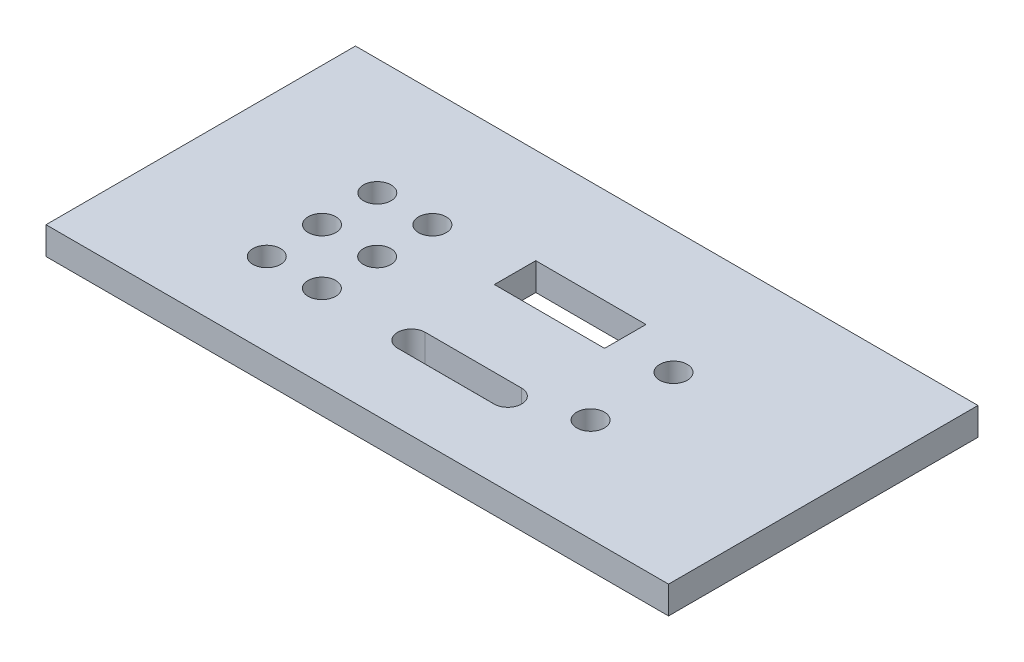
ISO-10303-21;
HEADER;
FILE_DESCRIPTION(('STEP AP214'),'2;1');
FILE_NAME('part.step','',(''),(''),'','','');
FILE_SCHEMA(('AUTOMOTIVE_DESIGN { 1 0 10303 214 1 1 1 1 }'));
ENDSEC;
DATA;
#1=APPLICATION_CONTEXT('core data for automotive mechanical design processes');
#2=APPLICATION_PROTOCOL_DEFINITION('international standard','automotive_design',2000,#1);
#3=PRODUCT_CONTEXT('',#1,'mechanical');
#4=PRODUCT('Part','Part','',(#3));
#5=PRODUCT_RELATED_PRODUCT_CATEGORY('part','',(#4));
#6=PRODUCT_DEFINITION_FORMATION('','',#4);
#7=PRODUCT_DEFINITION_CONTEXT('part definition',#1,'design');
#8=PRODUCT_DEFINITION('design','',#6,#7);
#9=PRODUCT_DEFINITION_SHAPE('','',#8);
#10=(LENGTH_UNIT() NAMED_UNIT(*) SI_UNIT(.MILLI.,.METRE.));
#11=(NAMED_UNIT(*) PLANE_ANGLE_UNIT() SI_UNIT($,.RADIAN.));
#12=(NAMED_UNIT(*) SI_UNIT($,.STERADIAN.) SOLID_ANGLE_UNIT());
#13=UNCERTAINTY_MEASURE_WITH_UNIT(LENGTH_MEASURE(1.E-05),#10,'distance_accuracy_value','');
#14=(GEOMETRIC_REPRESENTATION_CONTEXT(3) GLOBAL_UNCERTAINTY_ASSIGNED_CONTEXT((#13)) GLOBAL_UNIT_ASSIGNED_CONTEXT((#10,
#11,#12)) REPRESENTATION_CONTEXT('',''));
#15=CARTESIAN_POINT('',(0.,0.,0.));
#16=DIRECTION('',(0.,0.,1.));
#17=DIRECTION('',(1.,0.,0.));
#18=AXIS2_PLACEMENT_3D('',#15,#16,#17);
#19=CARTESIAN_POINT('',(-112.800521338315,10.,56.0742476017058));
#20=DIRECTION('',(1.,0.,0.));
#21=DIRECTION('',(0.,0.,-1.));
#22=AXIS2_PLACEMENT_3D('',#19,#20,#21);
#23=PLANE('',#22);
#24=DIRECTION('',(0.,0.,1.));
#25=VECTOR('',#24,1.);
#26=CARTESIAN_POINT('',(-112.800521338315,0.,56.0742476017058));
#27=LINE('',#26,#25);
#28=CARTESIAN_POINT('',(-112.800521338315,0.,-56.0742476017058));
#29=VERTEX_POINT('',#28);
#30=CARTESIAN_POINT('',(-112.800521338315,0.,56.0742476017058));
#31=VERTEX_POINT('',#30);
#32=EDGE_CURVE('E210',#29,#31,#27,.T.);
#33=ORIENTED_EDGE('',*,*,#32,.T.);
#34=DIRECTION('',(0.,-1.,0.));
#35=VECTOR('',#34,1.);
#36=CARTESIAN_POINT('',(-112.800521338315,10.,56.0742476017058));
#37=LINE('',#36,#35);
#38=CARTESIAN_POINT('',(-112.800521338315,10.,56.0742476017058));
#39=VERTEX_POINT('',#38);
#40=EDGE_CURVE('E11',#39,#31,#37,.T.);
#41=ORIENTED_EDGE('',*,*,#40,.F.);
#42=DIRECTION('',(0.,0.,1.));
#43=VECTOR('',#42,1.);
#44=CARTESIAN_POINT('',(-112.800521338315,10.,56.0742476017058));
#45=LINE('',#44,#43);
#46=CARTESIAN_POINT('',(-112.800521338315,10.,-56.0742476017058));
#47=VERTEX_POINT('',#46);
#48=EDGE_CURVE('E213',#47,#39,#45,.T.);
#49=ORIENTED_EDGE('',*,*,#48,.F.);
#50=DIRECTION('',(0.,-1.,0.));
#51=VECTOR('',#50,1.);
#52=CARTESIAN_POINT('',(-112.800521338315,10.,-56.0742476017058));
#53=LINE('',#52,#51);
#54=EDGE_CURVE('E223',#47,#29,#53,.T.);
#55=ORIENTED_EDGE('',*,*,#54,.T.);
#56=EDGE_LOOP('',(#33,#41,#49,#55));
#57=FACE_BOUND('',#56,.T.);
#58=ADVANCED_FACE('F33',(#57),#23,.F.);
#59=CARTESIAN_POINT('',(112.800521338315,10.,56.0742476017058));
#60=DIRECTION('',(0.,0.,-1.));
#61=DIRECTION('',(-1.,0.,0.));
#62=AXIS2_PLACEMENT_3D('',#59,#60,#61);
#63=PLANE('',#62);
#64=DIRECTION('',(1.,0.,0.));
#65=VECTOR('',#64,1.);
#66=CARTESIAN_POINT('',(112.800521338315,0.,56.0742476017058));
#67=LINE('',#66,#65);
#68=CARTESIAN_POINT('',(112.800521338315,0.,56.0742476017058));
#69=VERTEX_POINT('',#68);
#70=EDGE_CURVE('E226',#31,#69,#67,.T.);
#71=ORIENTED_EDGE('',*,*,#70,.T.);
#72=DIRECTION('',(0.,-1.,0.));
#73=VECTOR('',#72,1.);
#74=CARTESIAN_POINT('',(112.800521338315,10.,56.0742476017058));
#75=LINE('',#74,#73);
#76=CARTESIAN_POINT('',(112.800521338315,10.,56.0742476017058));
#77=VERTEX_POINT('',#76);
#78=EDGE_CURVE('E40',#77,#69,#75,.T.);
#79=ORIENTED_EDGE('',*,*,#78,.F.);
#80=DIRECTION('',(1.,0.,0.));
#81=VECTOR('',#80,1.);
#82=CARTESIAN_POINT('',(112.800521338315,10.,56.0742476017058));
#83=LINE('',#82,#81);
#84=EDGE_CURVE('E216',#39,#77,#83,.T.);
#85=ORIENTED_EDGE('',*,*,#84,.F.);
#86=ORIENTED_EDGE('',*,*,#40,.T.);
#87=EDGE_LOOP('',(#71,#79,#85,#86));
#88=FACE_BOUND('',#87,.T.);
#89=ADVANCED_FACE('F255',(#88),#63,.F.);
#90=CARTESIAN_POINT('',(112.800521338315,10.,56.0742476017058));
#91=DIRECTION('',(-1.,0.,0.));
#92=DIRECTION('',(0.,0.,1.));
#93=AXIS2_PLACEMENT_3D('',#90,#91,#92);
#94=PLANE('',#93);
#95=DIRECTION('',(0.,0.,-1.));
#96=VECTOR('',#95,1.);
#97=CARTESIAN_POINT('',(112.800521338315,0.,56.0742476017058));
#98=LINE('',#97,#96);
#99=CARTESIAN_POINT('',(112.800521338315,0.,-56.0742476017058));
#100=VERTEX_POINT('',#99);
#101=EDGE_CURVE('E228',#69,#100,#98,.T.);
#102=ORIENTED_EDGE('',*,*,#101,.T.);
#103=DIRECTION('',(0.,-1.,0.));
#104=VECTOR('',#103,1.);
#105=CARTESIAN_POINT('',(112.800521338315,10.,-56.0742476017058));
#106=LINE('',#105,#104);
#107=CARTESIAN_POINT('',(112.800521338315,10.,-56.0742476017058));
#108=VERTEX_POINT('',#107);
#109=EDGE_CURVE('E233',#108,#100,#106,.T.);
#110=ORIENTED_EDGE('',*,*,#109,.F.);
#111=DIRECTION('',(0.,0.,-1.));
#112=VECTOR('',#111,1.);
#113=CARTESIAN_POINT('',(112.800521338315,10.,56.0742476017058));
#114=LINE('',#113,#112);
#115=EDGE_CURVE('E219',#77,#108,#114,.T.);
#116=ORIENTED_EDGE('',*,*,#115,.F.);
#117=ORIENTED_EDGE('',*,*,#78,.T.);
#118=EDGE_LOOP('',(#102,#110,#116,#117));
#119=FACE_BOUND('',#118,.T.);
#120=ADVANCED_FACE('F240',(#119),#94,.F.);
#121=CARTESIAN_POINT('',(112.800521338315,10.,-56.0742476017058));
#122=DIRECTION('',(0.,0.,1.));
#123=DIRECTION('',(1.,0.,0.));
#124=AXIS2_PLACEMENT_3D('',#121,#122,#123);
#125=PLANE('',#124);
#126=DIRECTION('',(-1.,0.,0.));
#127=VECTOR('',#126,1.);
#128=CARTESIAN_POINT('',(112.800521338315,0.,-56.0742476017058));
#129=LINE('',#128,#127);
#130=EDGE_CURVE('E217',#100,#29,#129,.T.);
#131=ORIENTED_EDGE('',*,*,#130,.T.);
#132=ORIENTED_EDGE('',*,*,#54,.F.);
#133=DIRECTION('',(-1.,0.,0.));
#134=VECTOR('',#133,1.);
#135=CARTESIAN_POINT('',(112.800521338315,10.,-56.0742476017058));
#136=LINE('',#135,#134);
#137=EDGE_CURVE('E221',#108,#47,#136,.T.);
#138=ORIENTED_EDGE('',*,*,#137,.F.);
#139=ORIENTED_EDGE('',*,*,#109,.T.);
#140=EDGE_LOOP('',(#131,#132,#138,#139));
#141=FACE_BOUND('',#140,.T.);
#142=ADVANCED_FACE('F248',(#141),#125,.F.);
#143=CARTESIAN_POINT('',(0.,10.,0.));
#144=DIRECTION('',(0.,1.,0.));
#145=DIRECTION('',(0.,0.,1.));
#146=AXIS2_PLACEMENT_3D('',#143,#144,#145);
#147=PLANE('',#146);
#148=CARTESIAN_POINT('',(-62.7722379764121,10.,-13.9539958192126));
#149=DIRECTION('',(0.,1.,0.));
#150=DIRECTION('',(0.,0.,1.));
#151=AXIS2_PLACEMENT_3D('',#148,#149,#150);
#152=CIRCLE('',#151,5.);
#153=CARTESIAN_POINT('',(-62.7722379764121,10.,-8.95399581921262));
#154=VERTEX_POINT('',#153);
#155=EDGE_CURVE('E356',#154,#154,#152,.T.);
#156=ORIENTED_EDGE('',*,*,#155,.F.);
#157=EDGE_LOOP('',(#156));
#158=FACE_BOUND('',#157,.T.);
#159=CARTESIAN_POINT('',(-62.8005013678229,10.,6.04598421029506));
#160=DIRECTION('',(0.,1.,0.));
#161=DIRECTION('',(0.,0.,1.));
#162=AXIS2_PLACEMENT_3D('',#159,#160,#161);
#163=CIRCLE('',#162,5.);
#164=CARTESIAN_POINT('',(-62.8005013678229,10.,11.0459842102951));
#165=VERTEX_POINT('',#164);
#166=EDGE_CURVE('E148',#165,#165,#163,.T.);
#167=ORIENTED_EDGE('',*,*,#166,.F.);
#168=EDGE_LOOP('',(#167));
#169=FACE_BOUND('',#168,.T.);
#170=CARTESIAN_POINT('',(-62.8287647592336,10.,26.0459642398027));
#171=DIRECTION('',(0.,1.,0.));
#172=DIRECTION('',(0.,0.,1.));
#173=AXIS2_PLACEMENT_3D('',#170,#171,#172);
#174=CIRCLE('',#173,5.00000000000001);
#175=CARTESIAN_POINT('',(-62.8287647592336,10.,31.0459642398027));
#176=VERTEX_POINT('',#175);
#177=EDGE_CURVE('E346',#176,#176,#174,.T.);
#178=ORIENTED_EDGE('',*,*,#177,.F.);
#179=EDGE_LOOP('',(#178));
#180=FACE_BOUND('',#179,.T.);
#181=CARTESIAN_POINT('',(-42.8005213383152,10.,6.0742476017058));
#182=DIRECTION('',(0.,1.,0.));
#183=DIRECTION('',(0.,0.,1.));
#184=AXIS2_PLACEMENT_3D('',#181,#182,#183);
#185=CIRCLE('',#184,5.);
#186=CARTESIAN_POINT('',(-42.8005213383152,10.,11.0742476017058));
#187=VERTEX_POINT('',#186);
#188=EDGE_CURVE('E340',#187,#187,#185,.T.);
#189=ORIENTED_EDGE('',*,*,#188,.F.);
#190=EDGE_LOOP('',(#189));
#191=FACE_BOUND('',#190,.T.);
#192=CARTESIAN_POINT('',(47.2241192619538,10.,-11.2985496627651));
#193=DIRECTION('',(0.,1.,0.));
#194=DIRECTION('',(0.,0.,1.));
#195=AXIS2_PLACEMENT_3D('',#192,#193,#194);
#196=CIRCLE('',#195,5.);
#197=CARTESIAN_POINT('',(47.2241192619538,10.,-6.29854966276509));
#198=VERTEX_POINT('',#197);
#199=EDGE_CURVE('E174',#198,#198,#196,.T.);
#200=ORIENTED_EDGE('',*,*,#199,.F.);
#201=EDGE_LOOP('',(#200));
#202=FACE_BOUND('',#201,.T.);
#203=CARTESIAN_POINT('',(24.6711478698625,10.,26.1696165772247));
#204=DIRECTION('',(0.,1.,0.));
#205=DIRECTION('',(0.,0.,1.));
#206=AXIS2_PLACEMENT_3D('',#203,#204,#205);
#207=CIRCLE('',#206,5.);
#208=CARTESIAN_POINT('',(24.6640820220098,10.,31.1696115846016));
#209=VERTEX_POINT('',#208);
#210=CARTESIAN_POINT('',(24.6782137177152,10.,21.1696215698478));
#211=VERTEX_POINT('',#210);
#212=EDGE_CURVE('E47',#209,#211,#207,.T.);
#213=ORIENTED_EDGE('',*,*,#212,.F.);
#214=DIRECTION('',(0.999999001475384,0.,0.00141316957053689));
#215=VECTOR('',#214,1.);
#216=CARTESIAN_POINT('',(24.6640820220098,10.,31.1696115846016));
#217=LINE('',#216,#215);
#218=CARTESIAN_POINT('',(-10.3358830296286,10.,31.1201506496329));
#219=VERTEX_POINT('',#218);
#220=EDGE_CURVE('E182',#219,#209,#217,.T.);
#221=ORIENTED_EDGE('',*,*,#220,.F.);
#222=CARTESIAN_POINT('',(-10.3288171817759,10.,26.1201556422559));
#223=DIRECTION('',(0.,1.,0.));
#224=DIRECTION('',(0.,0.,1.));
#225=AXIS2_PLACEMENT_3D('',#222,#223,#224);
#226=CIRCLE('',#225,5.);
#227=CARTESIAN_POINT('',(-10.3217513339233,10.,21.120160634879));
#228=VERTEX_POINT('',#227);
#229=EDGE_CURVE('E196',#228,#219,#226,.T.);
#230=ORIENTED_EDGE('',*,*,#229,.F.);
#231=DIRECTION('',(-0.999999001475384,0.,-0.00141316957053689));
#232=VECTOR('',#231,1.);
#233=CARTESIAN_POINT('',(24.6782137177152,10.,21.1696215698478));
#234=LINE('',#233,#232);
#235=EDGE_CURVE('E193',#211,#228,#234,.T.);
#236=ORIENTED_EDGE('',*,*,#235,.F.);
#237=EDGE_LOOP('',(#213,#221,#230,#236));
#238=FACE_BOUND('',#237,.T.);
#239=DIRECTION('',(0.00141316957053689,0.,-0.999999001475384));
#240=VECTOR('',#239,1.);
#241=CARTESIAN_POINT('',(27.2382709281515,10.,-21.3268030689297));
#242=LINE('',#241,#240);
#243=CARTESIAN_POINT('',(27.2170733845934,10.,-6.32681804679891));
#244=VERTEX_POINT('',#243);
#245=CARTESIAN_POINT('',(27.2382709281515,10.,-21.3268030689297));
#246=VERTEX_POINT('',#245);
#247=EDGE_CURVE('E55',#244,#246,#242,.T.);
#248=ORIENTED_EDGE('',*,*,#247,.F.);
#249=DIRECTION('',(0.999999001475384,0.,0.00141316957053678));
#250=VECTOR('',#249,1.);
#251=CARTESIAN_POINT('',(-12.782886674422,10.,-6.38334482962039));
#252=LINE('',#251,#250);
#253=CARTESIAN_POINT('',(-12.782886674422,10.,-6.38334482962039));
#254=VERTEX_POINT('',#253);
#255=EDGE_CURVE('E142',#254,#244,#252,.T.);
#256=ORIENTED_EDGE('',*,*,#255,.F.);
#257=DIRECTION('',(-0.00141316957053689,0.,0.999999001475384));
#258=VECTOR('',#257,1.);
#259=CARTESIAN_POINT('',(-12.7616891308639,10.,-21.3833298517511));
#260=LINE('',#259,#258);
#261=CARTESIAN_POINT('',(-12.7616891308639,10.,-21.3833298517511));
#262=VERTEX_POINT('',#261);
#263=EDGE_CURVE('E145',#262,#254,#260,.T.);
#264=ORIENTED_EDGE('',*,*,#263,.F.);
#265=DIRECTION('',(-0.999999001475384,0.,-0.00141316957053671));
#266=VECTOR('',#265,1.);
#267=CARTESIAN_POINT('',(-12.7616891308639,10.,-21.3833298517511));
#268=LINE('',#267,#266);
#269=EDGE_CURVE('E154',#246,#262,#268,.T.);
#270=ORIENTED_EDGE('',*,*,#269,.F.);
#271=EDGE_LOOP('',(#248,#256,#264,#270));
#272=FACE_BOUND('',#271,.T.);
#273=CARTESIAN_POINT('',(-42.7722579469045,10.,-13.9257324278019));
#274=DIRECTION('',(0.,1.,0.));
#275=DIRECTION('',(0.,0.,1.));
#276=AXIS2_PLACEMENT_3D('',#273,#274,#275);
#277=CIRCLE('',#276,5.);
#278=CARTESIAN_POINT('',(-42.7722579469045,10.,-8.92573242780188));
#279=VERTEX_POINT('',#278);
#280=EDGE_CURVE('E166',#279,#279,#277,.T.);
#281=ORIENTED_EDGE('',*,*,#280,.F.);
#282=EDGE_LOOP('',(#281));
#283=FACE_BOUND('',#282,.T.);
#284=CARTESIAN_POINT('',(-42.8287847297259,10.,26.0742276312135));
#285=DIRECTION('',(0.,1.,0.));
#286=DIRECTION('',(0.,0.,1.));
#287=AXIS2_PLACEMENT_3D('',#284,#285,#286);
#288=CIRCLE('',#287,5.00000000000001);
#289=CARTESIAN_POINT('',(-42.8287847297259,10.,31.0742276312135));
#290=VERTEX_POINT('',#289);
#291=EDGE_CURVE('E337',#290,#290,#288,.T.);
#292=ORIENTED_EDGE('',*,*,#291,.F.);
#293=EDGE_LOOP('',(#292));
#294=FACE_BOUND('',#293,.T.);
#295=CARTESIAN_POINT('',(47.1817241748377,10.,18.7014203814964));
#296=DIRECTION('',(0.,1.,0.));
#297=DIRECTION('',(0.,0.,1.));
#298=AXIS2_PLACEMENT_3D('',#295,#296,#297);
#299=CIRCLE('',#298,5.);
#300=CARTESIAN_POINT('',(47.1817241748377,10.,23.7014203814964));
#301=VERTEX_POINT('',#300);
#302=EDGE_CURVE('E173',#301,#301,#299,.T.);
#303=ORIENTED_EDGE('',*,*,#302,.F.);
#304=EDGE_LOOP('',(#303));
#305=FACE_BOUND('',#304,.T.);
#306=ORIENTED_EDGE('',*,*,#48,.T.);
#307=ORIENTED_EDGE('',*,*,#84,.T.);
#308=ORIENTED_EDGE('',*,*,#115,.T.);
#309=ORIENTED_EDGE('',*,*,#137,.T.);
#310=EDGE_LOOP('',(#306,#307,#308,#309));
#311=FACE_BOUND('',#310,.T.);
#312=ADVANCED_FACE('F254',(#158,#169,#180,#191,#202,#238,#272,#283,#294,#305,#311),#147,.T.);
#313=CARTESIAN_POINT('',(0.,0.,0.));
#314=DIRECTION('',(0.,1.,0.));
#315=DIRECTION('',(0.,0.,1.));
#316=AXIS2_PLACEMENT_3D('',#313,#314,#315);
#317=PLANE('',#316);
#318=CARTESIAN_POINT('',(-62.7722379764121,0.,-13.9539958192126));
#319=DIRECTION('',(0.,1.,0.));
#320=DIRECTION('',(0.,0.,1.));
#321=AXIS2_PLACEMENT_3D('',#318,#319,#320);
#322=CIRCLE('',#321,5.);
#323=CARTESIAN_POINT('',(-62.7722379764121,0.,-8.95399581921262));
#324=VERTEX_POINT('',#323);
#325=EDGE_CURVE('E169',#324,#324,#322,.T.);
#326=ORIENTED_EDGE('',*,*,#325,.T.);
#327=EDGE_LOOP('',(#326));
#328=FACE_BOUND('',#327,.T.);
#329=CARTESIAN_POINT('',(-62.8005013678229,0.,6.04598421029506));
#330=DIRECTION('',(0.,1.,0.));
#331=DIRECTION('',(0.,0.,1.));
#332=AXIS2_PLACEMENT_3D('',#329,#330,#331);
#333=CIRCLE('',#332,5.);
#334=CARTESIAN_POINT('',(-62.8005013678229,0.,11.0459842102951));
#335=VERTEX_POINT('',#334);
#336=EDGE_CURVE('E358',#335,#335,#333,.T.);
#337=ORIENTED_EDGE('',*,*,#336,.T.);
#338=EDGE_LOOP('',(#337));
#339=FACE_BOUND('',#338,.T.);
#340=CARTESIAN_POINT('',(-62.8287647592336,0.,26.0459642398027));
#341=DIRECTION('',(0.,1.,0.));
#342=DIRECTION('',(0.,0.,1.));
#343=AXIS2_PLACEMENT_3D('',#340,#341,#342);
#344=CIRCLE('',#343,5.00000000000001);
#345=CARTESIAN_POINT('',(-62.8287647592336,0.,31.0459642398027));
#346=VERTEX_POINT('',#345);
#347=EDGE_CURVE('E343',#346,#346,#344,.T.);
#348=ORIENTED_EDGE('',*,*,#347,.T.);
#349=EDGE_LOOP('',(#348));
#350=FACE_BOUND('',#349,.T.);
#351=CARTESIAN_POINT('',(-42.8005213383152,0.,6.0742476017058));
#352=DIRECTION('',(0.,1.,0.));
#353=DIRECTION('',(0.,0.,1.));
#354=AXIS2_PLACEMENT_3D('',#351,#352,#353);
#355=CIRCLE('',#354,5.);
#356=CARTESIAN_POINT('',(-42.8005213383152,0.,11.0742476017058));
#357=VERTEX_POINT('',#356);
#358=EDGE_CURVE('E349',#357,#357,#355,.T.);
#359=ORIENTED_EDGE('',*,*,#358,.T.);
#360=EDGE_LOOP('',(#359));
#361=FACE_BOUND('',#360,.T.);
#362=CARTESIAN_POINT('',(47.2241192619538,0.,-11.2985496627651));
#363=DIRECTION('',(0.,1.,0.));
#364=DIRECTION('',(0.,0.,1.));
#365=AXIS2_PLACEMENT_3D('',#362,#363,#364);
#366=CIRCLE('',#365,5.);
#367=CARTESIAN_POINT('',(47.2241192619538,0.,-6.29854966276509));
#368=VERTEX_POINT('',#367);
#369=EDGE_CURVE('E170',#368,#368,#366,.T.);
#370=ORIENTED_EDGE('',*,*,#369,.T.);
#371=EDGE_LOOP('',(#370));
#372=FACE_BOUND('',#371,.T.);
#373=DIRECTION('',(0.999999001475384,0.,0.00141316957053689));
#374=VECTOR('',#373,1.);
#375=CARTESIAN_POINT('',(24.6640820220098,0.,31.1696115846016));
#376=LINE('',#375,#374);
#377=CARTESIAN_POINT('',(-10.3358830296286,0.,31.1201506496329));
#378=VERTEX_POINT('',#377);
#379=CARTESIAN_POINT('',(24.6640820220098,0.,31.1696115846016));
#380=VERTEX_POINT('',#379);
#381=EDGE_CURVE('E188',#378,#380,#376,.T.);
#382=ORIENTED_EDGE('',*,*,#381,.T.);
#383=CARTESIAN_POINT('',(24.6711478698625,0.,26.1696165772247));
#384=DIRECTION('',(0.,1.,0.));
#385=DIRECTION('',(0.,0.,1.));
#386=AXIS2_PLACEMENT_3D('',#383,#384,#385);
#387=CIRCLE('',#386,5.);
#388=CARTESIAN_POINT('',(24.6782137177152,0.,21.1696215698478));
#389=VERTEX_POINT('',#388);
#390=EDGE_CURVE('E178',#380,#389,#387,.T.);
#391=ORIENTED_EDGE('',*,*,#390,.T.);
#392=DIRECTION('',(-0.999999001475384,0.,-0.00141316957053689));
#393=VECTOR('',#392,1.);
#394=CARTESIAN_POINT('',(24.6782137177152,0.,21.1696215698478));
#395=LINE('',#394,#393);
#396=CARTESIAN_POINT('',(-10.3217513339233,0.,21.120160634879));
#397=VERTEX_POINT('',#396);
#398=EDGE_CURVE('E181',#389,#397,#395,.T.);
#399=ORIENTED_EDGE('',*,*,#398,.T.);
#400=CARTESIAN_POINT('',(-10.3288171817759,0.,26.1201556422559));
#401=DIRECTION('',(0.,1.,0.));
#402=DIRECTION('',(0.,0.,1.));
#403=AXIS2_PLACEMENT_3D('',#400,#401,#402);
#404=CIRCLE('',#403,5.);
#405=EDGE_CURVE('E185',#397,#378,#404,.T.);
#406=ORIENTED_EDGE('',*,*,#405,.T.);
#407=EDGE_LOOP('',(#382,#391,#399,#406));
#408=FACE_BOUND('',#407,.T.);
#409=DIRECTION('',(0.999999001475384,0.,0.00141316957053678));
#410=VECTOR('',#409,1.);
#411=CARTESIAN_POINT('',(-12.782886674422,0.,-6.38334482962039));
#412=LINE('',#411,#410);
#413=CARTESIAN_POINT('',(-12.782886674422,0.,-6.38334482962039));
#414=VERTEX_POINT('',#413);
#415=CARTESIAN_POINT('',(27.2170733845934,0.,-6.32681804679891));
#416=VERTEX_POINT('',#415);
#417=EDGE_CURVE('E129',#414,#416,#412,.T.);
#418=ORIENTED_EDGE('',*,*,#417,.T.);
#419=DIRECTION('',(0.00141316957053689,0.,-0.999999001475384));
#420=VECTOR('',#419,1.);
#421=CARTESIAN_POINT('',(27.2382709281515,0.,-21.3268030689297));
#422=LINE('',#421,#420);
#423=CARTESIAN_POINT('',(27.2382709281515,0.,-21.3268030689297));
#424=VERTEX_POINT('',#423);
#425=EDGE_CURVE('E123',#416,#424,#422,.T.);
#426=ORIENTED_EDGE('',*,*,#425,.T.);
#427=DIRECTION('',(-0.999999001475384,0.,-0.00141316957053671));
#428=VECTOR('',#427,1.);
#429=CARTESIAN_POINT('',(-12.7616891308639,0.,-21.3833298517511));
#430=LINE('',#429,#428);
#431=CARTESIAN_POINT('',(-12.7616891308639,0.,-21.3833298517511));
#432=VERTEX_POINT('',#431);
#433=EDGE_CURVE('E133',#424,#432,#430,.T.);
#434=ORIENTED_EDGE('',*,*,#433,.T.);
#435=DIRECTION('',(-0.00141316957053689,0.,0.999999001475384));
#436=VECTOR('',#435,1.);
#437=CARTESIAN_POINT('',(-12.7616891308639,0.,-21.3833298517511));
#438=LINE('',#437,#436);
#439=EDGE_CURVE('E137',#432,#414,#438,.T.);
#440=ORIENTED_EDGE('',*,*,#439,.T.);
#441=EDGE_LOOP('',(#418,#426,#434,#440));
#442=FACE_BOUND('',#441,.T.);
#443=CARTESIAN_POINT('',(-42.7722579469045,0.,-13.9257324278019));
#444=DIRECTION('',(0.,1.,0.));
#445=DIRECTION('',(0.,0.,1.));
#446=AXIS2_PLACEMENT_3D('',#443,#444,#445);
#447=CIRCLE('',#446,5.);
#448=CARTESIAN_POINT('',(-42.7722579469045,0.,-8.92573242780188));
#449=VERTEX_POINT('',#448);
#450=EDGE_CURVE('E155',#449,#449,#447,.T.);
#451=ORIENTED_EDGE('',*,*,#450,.T.);
#452=EDGE_LOOP('',(#451));
#453=FACE_BOUND('',#452,.T.);
#454=CARTESIAN_POINT('',(-42.8287847297259,0.,26.0742276312135));
#455=DIRECTION('',(0.,1.,0.));
#456=DIRECTION('',(0.,0.,1.));
#457=AXIS2_PLACEMENT_3D('',#454,#455,#456);
#458=CIRCLE('',#457,5.00000000000001);
#459=CARTESIAN_POINT('',(-42.8287847297259,0.,31.0742276312135));
#460=VERTEX_POINT('',#459);
#461=EDGE_CURVE('E334',#460,#460,#458,.T.);
#462=ORIENTED_EDGE('',*,*,#461,.T.);
#463=EDGE_LOOP('',(#462));
#464=FACE_BOUND('',#463,.T.);
#465=CARTESIAN_POINT('',(47.1817241748377,0.,18.7014203814964));
#466=DIRECTION('',(0.,1.,0.));
#467=DIRECTION('',(0.,0.,1.));
#468=AXIS2_PLACEMENT_3D('',#465,#466,#467);
#469=CIRCLE('',#468,5.);
#470=CARTESIAN_POINT('',(47.1817241748377,0.,23.7014203814964));
#471=VERTEX_POINT('',#470);
#472=EDGE_CURVE('E207',#471,#471,#469,.T.);
#473=ORIENTED_EDGE('',*,*,#472,.T.);
#474=EDGE_LOOP('',(#473));
#475=FACE_BOUND('',#474,.T.);
#476=ORIENTED_EDGE('',*,*,#32,.F.);
#477=ORIENTED_EDGE('',*,*,#130,.F.);
#478=ORIENTED_EDGE('',*,*,#101,.F.);
#479=ORIENTED_EDGE('',*,*,#70,.F.);
#480=EDGE_LOOP('',(#476,#477,#478,#479));
#481=FACE_BOUND('',#480,.T.);
#482=ADVANCED_FACE('F139',(#328,#339,#350,#361,#372,#408,#442,#453,#464,#475,#481),#317,.F.);
#483=CARTESIAN_POINT('',(47.1817241748377,0.,18.7014203814964));
#484=DIRECTION('',(0.,1.,0.));
#485=DIRECTION('',(0.,0.,1.));
#486=AXIS2_PLACEMENT_3D('',#483,#484,#485);
#487=CYLINDRICAL_SURFACE('',#486,5.);
#488=ORIENTED_EDGE('',*,*,#472,.F.);
#489=EDGE_LOOP('',(#488));
#490=FACE_BOUND('',#489,.T.);
#491=ORIENTED_EDGE('',*,*,#302,.T.);
#492=EDGE_LOOP('',(#491));
#493=FACE_BOUND('',#492,.T.);
#494=ADVANCED_FACE('F267',(#490,#493),#487,.F.);
#495=CARTESIAN_POINT('',(-42.8287847297259,0.,26.0742276312135));
#496=DIRECTION('',(0.,1.,0.));
#497=DIRECTION('',(0.,0.,1.));
#498=AXIS2_PLACEMENT_3D('',#495,#496,#497);
#499=CYLINDRICAL_SURFACE('',#498,5.00000000000001);
#500=ORIENTED_EDGE('',*,*,#461,.F.);
#501=EDGE_LOOP('',(#500));
#502=FACE_BOUND('',#501,.T.);
#503=ORIENTED_EDGE('',*,*,#291,.T.);
#504=EDGE_LOOP('',(#503));
#505=FACE_BOUND('',#504,.T.);
#506=ADVANCED_FACE('F274',(#502,#505),#499,.F.);
#507=CARTESIAN_POINT('',(-42.7722579469045,0.,-13.9257324278019));
#508=DIRECTION('',(0.,1.,0.));
#509=DIRECTION('',(0.,0.,1.));
#510=AXIS2_PLACEMENT_3D('',#507,#508,#509);
#511=CYLINDRICAL_SURFACE('',#510,5.);
#512=ORIENTED_EDGE('',*,*,#450,.F.);
#513=EDGE_LOOP('',(#512));
#514=FACE_BOUND('',#513,.T.);
#515=ORIENTED_EDGE('',*,*,#280,.T.);
#516=EDGE_LOOP('',(#515));
#517=FACE_BOUND('',#516,.T.);
#518=ADVANCED_FACE('F296',(#514,#517),#511,.F.);
#519=CARTESIAN_POINT('',(27.2382709281515,0.,-21.3268030689297));
#520=DIRECTION('',(0.999999001475384,0.,0.00141316957053689));
#521=DIRECTION('',(0.00141316957053689,0.,-0.999999001475384));
#522=AXIS2_PLACEMENT_3D('',#519,#520,#521);
#523=PLANE('',#522);
#524=ORIENTED_EDGE('',*,*,#247,.T.);
#525=DIRECTION('',(0.,1.,0.));
#526=VECTOR('',#525,1.);
#527=CARTESIAN_POINT('',(27.2382709281515,0.,-21.3268030689297));
#528=LINE('',#527,#526);
#529=EDGE_CURVE('E119',#424,#246,#528,.T.);
#530=ORIENTED_EDGE('',*,*,#529,.F.);
#531=ORIENTED_EDGE('',*,*,#425,.F.);
#532=DIRECTION('',(0.,1.,0.));
#533=VECTOR('',#532,1.);
#534=CARTESIAN_POINT('',(27.2170733845934,0.,-6.32681804679891));
#535=LINE('',#534,#533);
#536=EDGE_CURVE('E159',#416,#244,#535,.T.);
#537=ORIENTED_EDGE('',*,*,#536,.T.);
#538=EDGE_LOOP('',(#524,#530,#531,#537));
#539=FACE_BOUND('',#538,.T.);
#540=ADVANCED_FACE('F121',(#539),#523,.F.);
#541=CARTESIAN_POINT('',(-12.782886674422,0.,-6.38334482962039));
#542=DIRECTION('',(-0.00141316957053678,0.,0.999999001475384));
#543=DIRECTION('',(0.999999001475384,0.,0.00141316957053678));
#544=AXIS2_PLACEMENT_3D('',#541,#542,#543);
#545=PLANE('',#544);
#546=ORIENTED_EDGE('',*,*,#255,.T.);
#547=ORIENTED_EDGE('',*,*,#536,.F.);
#548=ORIENTED_EDGE('',*,*,#417,.F.);
#549=DIRECTION('',(0.,1.,0.));
#550=VECTOR('',#549,1.);
#551=CARTESIAN_POINT('',(-12.782886674422,0.,-6.38334482962039));
#552=LINE('',#551,#550);
#553=EDGE_CURVE('E161',#414,#254,#552,.T.);
#554=ORIENTED_EDGE('',*,*,#553,.T.);
#555=EDGE_LOOP('',(#546,#547,#548,#554));
#556=FACE_BOUND('',#555,.T.);
#557=ADVANCED_FACE('F302',(#556),#545,.F.);
#558=CARTESIAN_POINT('',(-12.7616891308639,0.,-21.3833298517511));
#559=DIRECTION('',(-0.999999001475384,0.,-0.00141316957053689));
#560=DIRECTION('',(-0.00141316957053689,0.,0.999999001475384));
#561=AXIS2_PLACEMENT_3D('',#558,#559,#560);
#562=PLANE('',#561);
#563=ORIENTED_EDGE('',*,*,#263,.T.);
#564=ORIENTED_EDGE('',*,*,#553,.F.);
#565=ORIENTED_EDGE('',*,*,#439,.F.);
#566=DIRECTION('',(0.,1.,0.));
#567=VECTOR('',#566,1.);
#568=CARTESIAN_POINT('',(-12.7616891308639,0.,-21.3833298517511));
#569=LINE('',#568,#567);
#570=EDGE_CURVE('E128',#432,#262,#569,.T.);
#571=ORIENTED_EDGE('',*,*,#570,.T.);
#572=EDGE_LOOP('',(#563,#564,#565,#571));
#573=FACE_BOUND('',#572,.T.);
#574=ADVANCED_FACE('F305',(#573),#562,.F.);
#575=CARTESIAN_POINT('',(-12.7616891308639,0.,-21.3833298517511));
#576=DIRECTION('',(0.00141316957053671,0.,-0.999999001475384));
#577=DIRECTION('',(-0.999999001475384,0.,-0.00141316957053671));
#578=AXIS2_PLACEMENT_3D('',#575,#576,#577);
#579=PLANE('',#578);
#580=ORIENTED_EDGE('',*,*,#269,.T.);
#581=ORIENTED_EDGE('',*,*,#570,.F.);
#582=ORIENTED_EDGE('',*,*,#433,.F.);
#583=ORIENTED_EDGE('',*,*,#529,.T.);
#584=EDGE_LOOP('',(#580,#581,#582,#583));
#585=FACE_BOUND('',#584,.T.);
#586=ADVANCED_FACE('F134',(#585),#579,.F.);
#587=CARTESIAN_POINT('',(24.6711478698625,0.,26.1696165772247));
#588=DIRECTION('',(0.,1.,0.));
#589=DIRECTION('',(0.,0.,1.));
#590=AXIS2_PLACEMENT_3D('',#587,#588,#589);
#591=CYLINDRICAL_SURFACE('',#590,5.);
#592=ORIENTED_EDGE('',*,*,#212,.T.);
#593=DIRECTION('',(0.,1.,0.));
#594=VECTOR('',#593,1.);
#595=CARTESIAN_POINT('',(24.6782137177152,0.,21.1696215698478));
#596=LINE('',#595,#594);
#597=EDGE_CURVE('E191',#389,#211,#596,.T.);
#598=ORIENTED_EDGE('',*,*,#597,.F.);
#599=ORIENTED_EDGE('',*,*,#390,.F.);
#600=DIRECTION('',(0.,1.,0.));
#601=VECTOR('',#600,1.);
#602=CARTESIAN_POINT('',(24.6640820220098,0.,31.1696115846016));
#603=LINE('',#602,#601);
#604=EDGE_CURVE('E177',#380,#209,#603,.T.);
#605=ORIENTED_EDGE('',*,*,#604,.T.);
#606=EDGE_LOOP('',(#592,#598,#599,#605));
#607=FACE_BOUND('',#606,.T.);
#608=ADVANCED_FACE('F276',(#607),#591,.F.);
#609=CARTESIAN_POINT('',(24.6640820220098,0.,31.1696115846016));
#610=DIRECTION('',(-0.00141316957053689,0.,0.999999001475384));
#611=DIRECTION('',(0.999999001475384,0.,0.00141316957053689));
#612=AXIS2_PLACEMENT_3D('',#609,#610,#611);
#613=PLANE('',#612);
#614=ORIENTED_EDGE('',*,*,#220,.T.);
#615=ORIENTED_EDGE('',*,*,#604,.F.);
#616=ORIENTED_EDGE('',*,*,#381,.F.);
#617=DIRECTION('',(0.,1.,0.));
#618=VECTOR('',#617,1.);
#619=CARTESIAN_POINT('',(-10.3358830296286,0.,31.1201506496329));
#620=LINE('',#619,#618);
#621=EDGE_CURVE('E202',#378,#219,#620,.T.);
#622=ORIENTED_EDGE('',*,*,#621,.T.);
#623=EDGE_LOOP('',(#614,#615,#616,#622));
#624=FACE_BOUND('',#623,.T.);
#625=ADVANCED_FACE('F279',(#624),#613,.F.);
#626=CARTESIAN_POINT('',(-10.3288171817759,0.,26.1201556422559));
#627=DIRECTION('',(0.,1.,0.));
#628=DIRECTION('',(0.,0.,1.));
#629=AXIS2_PLACEMENT_3D('',#626,#627,#628);
#630=CYLINDRICAL_SURFACE('',#629,5.);
#631=ORIENTED_EDGE('',*,*,#229,.T.);
#632=ORIENTED_EDGE('',*,*,#621,.F.);
#633=ORIENTED_EDGE('',*,*,#405,.F.);
#634=DIRECTION('',(0.,1.,0.));
#635=VECTOR('',#634,1.);
#636=CARTESIAN_POINT('',(-10.3217513339233,0.,21.120160634879));
#637=LINE('',#636,#635);
#638=EDGE_CURVE('E204',#397,#228,#637,.T.);
#639=ORIENTED_EDGE('',*,*,#638,.T.);
#640=EDGE_LOOP('',(#631,#632,#633,#639));
#641=FACE_BOUND('',#640,.T.);
#642=ADVANCED_FACE('F284',(#641),#630,.F.);
#643=CARTESIAN_POINT('',(24.6782137177152,0.,21.1696215698478));
#644=DIRECTION('',(0.00141316957053689,0.,-0.999999001475384));
#645=DIRECTION('',(-0.999999001475384,0.,-0.00141316957053689));
#646=AXIS2_PLACEMENT_3D('',#643,#644,#645);
#647=PLANE('',#646);
#648=ORIENTED_EDGE('',*,*,#235,.T.);
#649=ORIENTED_EDGE('',*,*,#638,.F.);
#650=ORIENTED_EDGE('',*,*,#398,.F.);
#651=ORIENTED_EDGE('',*,*,#597,.T.);
#652=EDGE_LOOP('',(#648,#649,#650,#651));
#653=FACE_BOUND('',#652,.T.);
#654=ADVANCED_FACE('F280',(#653),#647,.F.);
#655=CARTESIAN_POINT('',(47.2241192619538,0.,-11.2985496627651));
#656=DIRECTION('',(0.,1.,0.));
#657=DIRECTION('',(0.,0.,1.));
#658=AXIS2_PLACEMENT_3D('',#655,#656,#657);
#659=CYLINDRICAL_SURFACE('',#658,5.);
#660=ORIENTED_EDGE('',*,*,#369,.F.);
#661=EDGE_LOOP('',(#660));
#662=FACE_BOUND('',#661,.T.);
#663=ORIENTED_EDGE('',*,*,#199,.T.);
#664=EDGE_LOOP('',(#663));
#665=FACE_BOUND('',#664,.T.);
#666=ADVANCED_FACE('F283',(#662,#665),#659,.F.);
#667=CARTESIAN_POINT('',(-42.8005213383152,0.,6.0742476017058));
#668=DIRECTION('',(0.,1.,0.));
#669=DIRECTION('',(0.,0.,1.));
#670=AXIS2_PLACEMENT_3D('',#667,#668,#669);
#671=CYLINDRICAL_SURFACE('',#670,5.);
#672=ORIENTED_EDGE('',*,*,#358,.F.);
#673=EDGE_LOOP('',(#672));
#674=FACE_BOUND('',#673,.T.);
#675=ORIENTED_EDGE('',*,*,#188,.T.);
#676=EDGE_LOOP('',(#675));
#677=FACE_BOUND('',#676,.T.);
#678=ADVANCED_FACE('F294',(#674,#677),#671,.F.);
#679=CARTESIAN_POINT('',(-62.8287647592336,0.,26.0459642398027));
#680=DIRECTION('',(0.,1.,0.));
#681=DIRECTION('',(0.,0.,1.));
#682=AXIS2_PLACEMENT_3D('',#679,#680,#681);
#683=CYLINDRICAL_SURFACE('',#682,5.00000000000001);
#684=ORIENTED_EDGE('',*,*,#347,.F.);
#685=EDGE_LOOP('',(#684));
#686=FACE_BOUND('',#685,.T.);
#687=ORIENTED_EDGE('',*,*,#177,.T.);
#688=EDGE_LOOP('',(#687));
#689=FACE_BOUND('',#688,.T.);
#690=ADVANCED_FACE('F316',(#686,#689),#683,.F.);
#691=CARTESIAN_POINT('',(-62.8005013678229,0.,6.04598421029506));
#692=DIRECTION('',(0.,1.,0.));
#693=DIRECTION('',(0.,0.,1.));
#694=AXIS2_PLACEMENT_3D('',#691,#692,#693);
#695=CYLINDRICAL_SURFACE('',#694,5.);
#696=ORIENTED_EDGE('',*,*,#336,.F.);
#697=EDGE_LOOP('',(#696));
#698=FACE_BOUND('',#697,.T.);
#699=ORIENTED_EDGE('',*,*,#166,.T.);
#700=EDGE_LOOP('',(#699));
#701=FACE_BOUND('',#700,.T.);
#702=ADVANCED_FACE('F312',(#698,#701),#695,.F.);
#703=CARTESIAN_POINT('',(-62.7722379764121,0.,-13.9539958192126));
#704=DIRECTION('',(0.,1.,0.));
#705=DIRECTION('',(0.,0.,1.));
#706=AXIS2_PLACEMENT_3D('',#703,#704,#705);
#707=CYLINDRICAL_SURFACE('',#706,5.);
#708=ORIENTED_EDGE('',*,*,#325,.F.);
#709=EDGE_LOOP('',(#708));
#710=FACE_BOUND('',#709,.T.);
#711=ORIENTED_EDGE('',*,*,#155,.T.);
#712=EDGE_LOOP('',(#711));
#713=FACE_BOUND('',#712,.T.);
#714=ADVANCED_FACE('F315',(#710,#713),#707,.F.);
#715=CLOSED_SHELL('',(#58,#89,#120,#142,#312,#482,#494,#506,#518,#540,#557,#574,#586,#608,#625,
#642,#654,#666,#678,#690,#702,#714));
#716=MANIFOLD_SOLID_BREP('B2',#715);
#717=ADVANCED_BREP_SHAPE_REPRESENTATION('',(#18,#716),#14);
#718=SHAPE_DEFINITION_REPRESENTATION(#9,#717);
ENDSEC;
END-ISO-10303-21;
